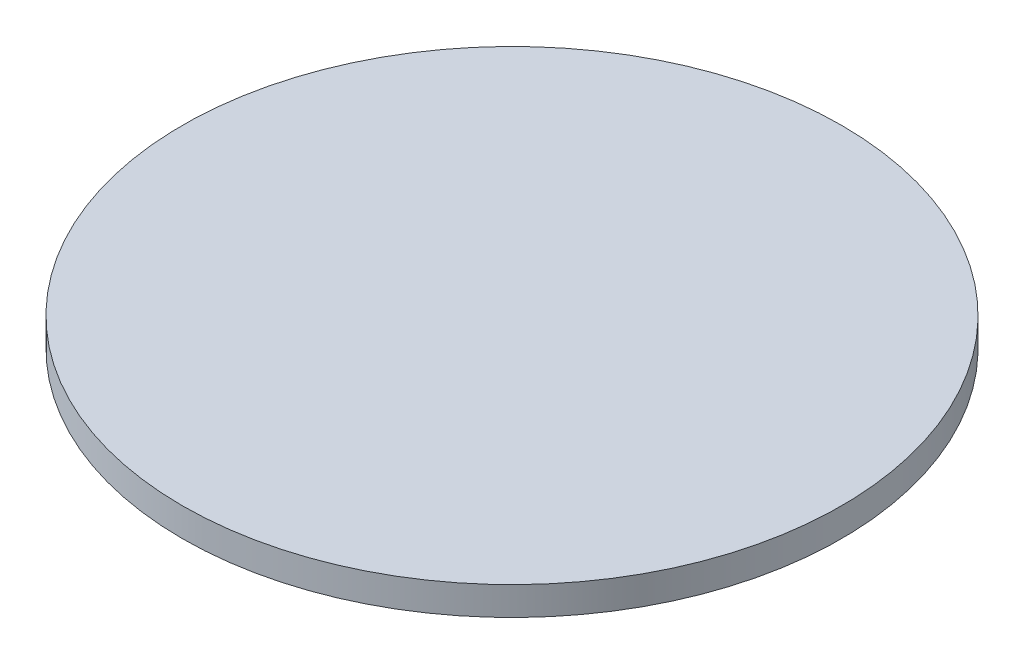
ISO-10303-21;
HEADER;
FILE_DESCRIPTION(('STEP AP214'),'2;1');
FILE_NAME('part.step','',(''),(''),'','','');
FILE_SCHEMA(('AUTOMOTIVE_DESIGN { 1 0 10303 214 1 1 1 1 }'));
ENDSEC;
DATA;
#1=APPLICATION_CONTEXT('core data for automotive mechanical design processes');
#2=APPLICATION_PROTOCOL_DEFINITION('international standard','automotive_design',2000,#1);
#3=PRODUCT_CONTEXT('',#1,'mechanical');
#4=PRODUCT('Part','Part','',(#3));
#5=PRODUCT_RELATED_PRODUCT_CATEGORY('part','',(#4));
#6=PRODUCT_DEFINITION_FORMATION('','',#4);
#7=PRODUCT_DEFINITION_CONTEXT('part definition',#1,'design');
#8=PRODUCT_DEFINITION('design','',#6,#7);
#9=PRODUCT_DEFINITION_SHAPE('','',#8);
#10=(LENGTH_UNIT() NAMED_UNIT(*) SI_UNIT(.MILLI.,.METRE.));
#11=(NAMED_UNIT(*) PLANE_ANGLE_UNIT() SI_UNIT($,.RADIAN.));
#12=(NAMED_UNIT(*) SI_UNIT($,.STERADIAN.) SOLID_ANGLE_UNIT());
#13=UNCERTAINTY_MEASURE_WITH_UNIT(LENGTH_MEASURE(1.E-05),#10,'distance_accuracy_value','');
#14=(GEOMETRIC_REPRESENTATION_CONTEXT(3) GLOBAL_UNCERTAINTY_ASSIGNED_CONTEXT((#13)) GLOBAL_UNIT_ASSIGNED_CONTEXT((#10,
#11,#12)) REPRESENTATION_CONTEXT('',''));
#15=CARTESIAN_POINT('',(0.,0.,0.));
#16=DIRECTION('',(0.,0.,1.));
#17=DIRECTION('',(1.,0.,0.));
#18=AXIS2_PLACEMENT_3D('',#15,#16,#17);
#19=CARTESIAN_POINT('',(0.,2.032,0.));
#20=DIRECTION('',(0.,-1.,0.));
#21=DIRECTION('',(0.,0.,-1.));
#22=AXIS2_PLACEMENT_3D('',#19,#20,#21);
#23=CYLINDRICAL_SURFACE('',#22,23.495);
#24=CARTESIAN_POINT('',(0.,2.032,0.));
#25=DIRECTION('',(0.,1.,0.));
#26=DIRECTION('',(0.,0.,1.));
#27=AXIS2_PLACEMENT_3D('',#24,#25,#26);
#28=CIRCLE('',#27,23.495);
#29=CARTESIAN_POINT('',(0.,2.032,23.495));
#30=VERTEX_POINT('',#29);
#31=EDGE_CURVE('E10',#30,#30,#28,.T.);
#32=ORIENTED_EDGE('',*,*,#31,.F.);
#33=EDGE_LOOP('',(#32));
#34=FACE_BOUND('',#33,.T.);
#35=CARTESIAN_POINT('',(0.,0.,0.));
#36=DIRECTION('',(0.,1.,0.));
#37=DIRECTION('',(0.,0.,1.));
#38=AXIS2_PLACEMENT_3D('',#35,#36,#37);
#39=CIRCLE('',#38,23.495);
#40=CARTESIAN_POINT('',(0.,0.,23.495));
#41=VERTEX_POINT('',#40);
#42=EDGE_CURVE('E34',#41,#41,#39,.T.);
#43=ORIENTED_EDGE('',*,*,#42,.T.);
#44=EDGE_LOOP('',(#43));
#45=FACE_BOUND('',#44,.T.);
#46=ADVANCED_FACE('F31',(#34,#45),#23,.T.);
#47=CARTESIAN_POINT('',(0.,2.032,0.));
#48=DIRECTION('',(0.,1.,0.));
#49=DIRECTION('',(0.,0.,1.));
#50=AXIS2_PLACEMENT_3D('',#47,#48,#49);
#51=PLANE('',#50);
#52=ORIENTED_EDGE('',*,*,#31,.T.);
#53=EDGE_LOOP('',(#52));
#54=FACE_BOUND('',#53,.T.);
#55=ADVANCED_FACE('F46',(#54),#51,.T.);
#56=CARTESIAN_POINT('',(0.,0.,0.));
#57=DIRECTION('',(0.,1.,0.));
#58=DIRECTION('',(0.,0.,1.));
#59=AXIS2_PLACEMENT_3D('',#56,#57,#58);
#60=PLANE('',#59);
#61=ORIENTED_EDGE('',*,*,#42,.F.);
#62=EDGE_LOOP('',(#61));
#63=FACE_BOUND('',#62,.T.);
#64=ADVANCED_FACE('F44',(#63),#60,.F.);
#65=CLOSED_SHELL('',(#46,#55,#64));
#66=MANIFOLD_SOLID_BREP('B2',#65);
#67=ADVANCED_BREP_SHAPE_REPRESENTATION('',(#18,#66),#14);
#68=SHAPE_DEFINITION_REPRESENTATION(#9,#67);
ENDSEC;
END-ISO-10303-21;
